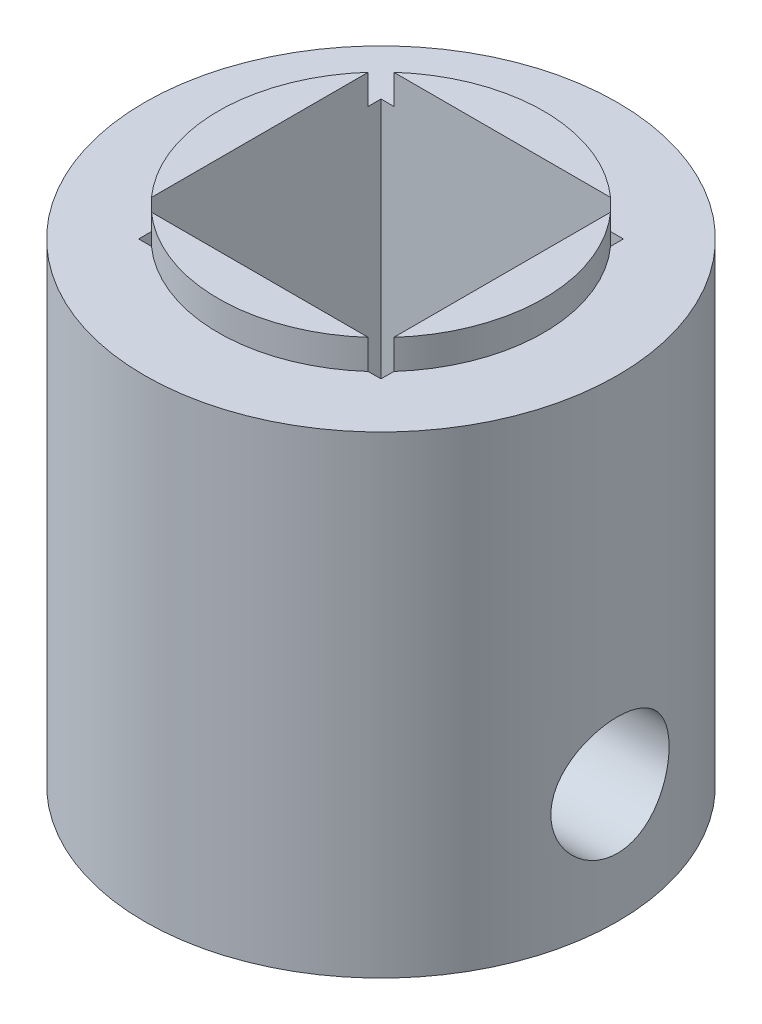
ISO-10303-21;
HEADER;
FILE_DESCRIPTION(('STEP AP214'),'2;1');
FILE_NAME('part.step','',(''),(''),'','','');
FILE_SCHEMA(('AUTOMOTIVE_DESIGN { 1 0 10303 214 1 1 1 1 }'));
ENDSEC;
DATA;
#1=APPLICATION_CONTEXT('core data for automotive mechanical design processes');
#2=APPLICATION_PROTOCOL_DEFINITION('international standard','automotive_design',2000,#1);
#3=PRODUCT_CONTEXT('',#1,'mechanical');
#4=PRODUCT('Part','Part','',(#3));
#5=PRODUCT_RELATED_PRODUCT_CATEGORY('part','',(#4));
#6=PRODUCT_DEFINITION_FORMATION('','',#4);
#7=PRODUCT_DEFINITION_CONTEXT('part definition',#1,'design');
#8=PRODUCT_DEFINITION('design','',#6,#7);
#9=PRODUCT_DEFINITION_SHAPE('','',#8);
#10=(LENGTH_UNIT() NAMED_UNIT(*) SI_UNIT(.MILLI.,.METRE.));
#11=(NAMED_UNIT(*) PLANE_ANGLE_UNIT() SI_UNIT($,.RADIAN.));
#12=(NAMED_UNIT(*) SI_UNIT($,.STERADIAN.) SOLID_ANGLE_UNIT());
#13=UNCERTAINTY_MEASURE_WITH_UNIT(LENGTH_MEASURE(1.E-05),#10,'distance_accuracy_value','');
#14=(GEOMETRIC_REPRESENTATION_CONTEXT(3) GLOBAL_UNCERTAINTY_ASSIGNED_CONTEXT((#13)) GLOBAL_UNIT_ASSIGNED_CONTEXT((#10,
#11,#12)) REPRESENTATION_CONTEXT('',''));
#15=CARTESIAN_POINT('',(0.,0.,0.));
#16=DIRECTION('',(0.,0.,1.));
#17=DIRECTION('',(1.,0.,0.));
#18=AXIS2_PLACEMENT_3D('',#15,#16,#17);
#19=CARTESIAN_POINT('',(0.,1.,0.));
#20=DIRECTION('',(0.,-1.,0.));
#21=DIRECTION('',(0.,0.,-1.));
#22=AXIS2_PLACEMENT_3D('',#19,#20,#21);
#23=CYLINDRICAL_SURFACE('',#22,5.5);
#24=CARTESIAN_POINT('',(0.,1.,0.));
#25=DIRECTION('',(0.,1.,0.));
#26=DIRECTION('',(0.,0.,1.));
#27=AXIS2_PLACEMENT_3D('',#24,#25,#26);
#28=CIRCLE('',#27,5.5);
#29=CARTESIAN_POINT('',(-4.1,1.,-3.66606055596467));
#30=VERTEX_POINT('',#29);
#31=CARTESIAN_POINT('',(-4.1,1.,3.66606055596467));
#32=VERTEX_POINT('',#31);
#33=EDGE_CURVE('E189',#30,#32,#28,.T.);
#34=ORIENTED_EDGE('',*,*,#33,.F.);
#35=DIRECTION('',(0.,-1.,0.));
#36=VECTOR('',#35,1.);
#37=CARTESIAN_POINT('',(-4.1,1.,-3.66606055596467));
#38=LINE('',#37,#36);
#39=CARTESIAN_POINT('',(-4.1,0.,-3.66606055596467));
#40=VERTEX_POINT('',#39);
#41=EDGE_CURVE('E173',#30,#40,#38,.T.);
#42=ORIENTED_EDGE('',*,*,#41,.T.);
#43=CARTESIAN_POINT('',(0.,0.,0.));
#44=DIRECTION('',(0.,1.,0.));
#45=DIRECTION('',(0.,0.,1.));
#46=AXIS2_PLACEMENT_3D('',#43,#44,#45);
#47=CIRCLE('',#46,5.5);
#48=CARTESIAN_POINT('',(-4.1,0.,3.66606055596467));
#49=VERTEX_POINT('',#48);
#50=EDGE_CURVE('E194',#40,#49,#47,.T.);
#51=ORIENTED_EDGE('',*,*,#50,.T.);
#52=DIRECTION('',(0.,-1.,0.));
#53=VECTOR('',#52,1.);
#54=CARTESIAN_POINT('',(-4.1,1.,3.66606055596467));
#55=LINE('',#54,#53);
#56=EDGE_CURVE('E176',#49,#32,#55,.F.);
#57=ORIENTED_EDGE('',*,*,#56,.T.);
#58=EDGE_LOOP('',(#34,#42,#51,#57));
#59=FACE_BOUND('',#58,.T.);
#60=ADVANCED_FACE('F33',(#59),#23,.T.);
#61=CARTESIAN_POINT('',(-3.66606055596467,1.,4.1));
#62=VERTEX_POINT('',#61);
#63=CARTESIAN_POINT('',(3.66606055596467,1.,4.1));
#64=VERTEX_POINT('',#63);
#65=EDGE_CURVE('E186',#62,#64,#28,.T.);
#66=ORIENTED_EDGE('',*,*,#65,.F.);
#67=DIRECTION('',(0.,-1.,0.));
#68=VECTOR('',#67,1.);
#69=CARTESIAN_POINT('',(-3.66606055596467,1.,4.1));
#70=LINE('',#69,#68);
#71=CARTESIAN_POINT('',(-3.66606055596467,0.,4.1));
#72=VERTEX_POINT('',#71);
#73=EDGE_CURVE('E167',#62,#72,#70,.T.);
#74=ORIENTED_EDGE('',*,*,#73,.T.);
#75=CARTESIAN_POINT('',(3.66606055596467,0.,4.1));
#76=VERTEX_POINT('',#75);
#77=EDGE_CURVE('E183',#72,#76,#47,.T.);
#78=ORIENTED_EDGE('',*,*,#77,.T.);
#79=DIRECTION('',(0.,-1.,0.));
#80=VECTOR('',#79,1.);
#81=CARTESIAN_POINT('',(3.66606055596467,1.,4.1));
#82=LINE('',#81,#80);
#83=EDGE_CURVE('E170',#76,#64,#82,.F.);
#84=ORIENTED_EDGE('',*,*,#83,.T.);
#85=EDGE_LOOP('',(#66,#74,#78,#84));
#86=FACE_BOUND('',#85,.T.);
#87=ADVANCED_FACE('F236',(#86),#23,.T.);
#88=CARTESIAN_POINT('',(4.1,1.,3.66606055596467));
#89=VERTEX_POINT('',#88);
#90=CARTESIAN_POINT('',(4.1,1.,-3.66606055596467));
#91=VERTEX_POINT('',#90);
#92=EDGE_CURVE('E191',#89,#91,#28,.T.);
#93=ORIENTED_EDGE('',*,*,#92,.F.);
#94=DIRECTION('',(0.,-1.,0.));
#95=VECTOR('',#94,1.);
#96=CARTESIAN_POINT('',(4.1,1.,3.66606055596467));
#97=LINE('',#96,#95);
#98=CARTESIAN_POINT('',(4.1,0.,3.66606055596467));
#99=VERTEX_POINT('',#98);
#100=EDGE_CURVE('E161',#89,#99,#97,.T.);
#101=ORIENTED_EDGE('',*,*,#100,.T.);
#102=CARTESIAN_POINT('',(4.1,0.,-3.66606055596467));
#103=VERTEX_POINT('',#102);
#104=EDGE_CURVE('E190',#99,#103,#47,.T.);
#105=ORIENTED_EDGE('',*,*,#104,.T.);
#106=DIRECTION('',(0.,-1.,0.));
#107=VECTOR('',#106,1.);
#108=CARTESIAN_POINT('',(4.1,1.,-3.66606055596467));
#109=LINE('',#108,#107);
#110=EDGE_CURVE('E164',#103,#91,#109,.F.);
#111=ORIENTED_EDGE('',*,*,#110,.T.);
#112=EDGE_LOOP('',(#93,#101,#105,#111));
#113=FACE_BOUND('',#112,.T.);
#114=ADVANCED_FACE('F213',(#113),#23,.T.);
#115=CARTESIAN_POINT('',(0.,1.,0.));
#116=DIRECTION('',(0.,1.,0.));
#117=DIRECTION('',(0.,0.,1.));
#118=AXIS2_PLACEMENT_3D('',#115,#116,#117);
#119=PLANE('',#118);
#120=DIRECTION('',(0.,0.,-1.));
#121=VECTOR('',#120,1.);
#122=CARTESIAN_POINT('',(-4.1,1.,-4.1));
#123=LINE('',#122,#121);
#124=EDGE_CURVE('E146',#32,#30,#123,.T.);
#125=ORIENTED_EDGE('',*,*,#124,.T.);
#126=ORIENTED_EDGE('',*,*,#33,.T.);
#127=EDGE_LOOP('',(#125,#126));
#128=FACE_BOUND('',#127,.T.);
#129=ADVANCED_FACE('F225',(#128),#119,.T.);
#130=DIRECTION('',(-1.,0.,0.));
#131=VECTOR('',#130,1.);
#132=CARTESIAN_POINT('',(4.1,1.,4.1));
#133=LINE('',#132,#131);
#134=EDGE_CURVE('E155',#64,#62,#133,.T.);
#135=ORIENTED_EDGE('',*,*,#134,.T.);
#136=ORIENTED_EDGE('',*,*,#65,.T.);
#137=EDGE_LOOP('',(#135,#136));
#138=FACE_BOUND('',#137,.T.);
#139=ADVANCED_FACE('F238',(#138),#119,.T.);
#140=DIRECTION('',(0.,0.,1.));
#141=VECTOR('',#140,1.);
#142=CARTESIAN_POINT('',(4.1,1.,-4.1));
#143=LINE('',#142,#141);
#144=EDGE_CURVE('E239',#91,#89,#143,.T.);
#145=ORIENTED_EDGE('',*,*,#144,.T.);
#146=ORIENTED_EDGE('',*,*,#92,.T.);
#147=EDGE_LOOP('',(#145,#146));
#148=FACE_BOUND('',#147,.T.);
#149=ADVANCED_FACE('F293',(#148),#119,.T.);
#150=CARTESIAN_POINT('',(3.66606055596467,1.,-4.1));
#151=VERTEX_POINT('',#150);
#152=CARTESIAN_POINT('',(-3.66606055596467,1.,-4.1));
#153=VERTEX_POINT('',#152);
#154=EDGE_CURVE('E216',#151,#153,#28,.T.);
#155=ORIENTED_EDGE('',*,*,#154,.F.);
#156=DIRECTION('',(0.,-1.,0.));
#157=VECTOR('',#156,1.);
#158=CARTESIAN_POINT('',(3.66606055596467,1.,-4.1));
#159=LINE('',#158,#157);
#160=CARTESIAN_POINT('',(3.66606055596467,0.,-4.1));
#161=VERTEX_POINT('',#160);
#162=EDGE_CURVE('E152',#151,#161,#159,.T.);
#163=ORIENTED_EDGE('',*,*,#162,.T.);
#164=CARTESIAN_POINT('',(-3.66606055596467,0.,-4.1));
#165=VERTEX_POINT('',#164);
#166=EDGE_CURVE('E415',#161,#165,#47,.T.);
#167=ORIENTED_EDGE('',*,*,#166,.T.);
#168=DIRECTION('',(0.,-1.,0.));
#169=VECTOR('',#168,1.);
#170=CARTESIAN_POINT('',(-3.66606055596467,1.,-4.1));
#171=LINE('',#170,#169);
#172=EDGE_CURVE('E158',#165,#153,#171,.F.);
#173=ORIENTED_EDGE('',*,*,#172,.T.);
#174=EDGE_LOOP('',(#155,#163,#167,#173));
#175=FACE_BOUND('',#174,.T.);
#176=ADVANCED_FACE('F35',(#175),#23,.T.);
#177=DIRECTION('',(1.,0.,0.));
#178=VECTOR('',#177,1.);
#179=CARTESIAN_POINT('',(4.1,1.,-4.1));
#180=LINE('',#179,#178);
#181=EDGE_CURVE('E241',#153,#151,#180,.T.);
#182=ORIENTED_EDGE('',*,*,#181,.T.);
#183=ORIENTED_EDGE('',*,*,#154,.T.);
#184=EDGE_LOOP('',(#182,#183));
#185=FACE_BOUND('',#184,.T.);
#186=ADVANCED_FACE('F292',(#185),#119,.T.);
#187=CARTESIAN_POINT('',(0.,-16.,0.));
#188=DIRECTION('',(0.,1.,0.));
#189=DIRECTION('',(0.,0.,1.));
#190=AXIS2_PLACEMENT_3D('',#187,#188,#189);
#191=CYLINDRICAL_SURFACE('',#190,8.);
#192=CARTESIAN_POINT('',(8.,-10.,0.));
#193=CARTESIAN_POINT('',(7.9999981315735,-10.0000031009842,-0.110501451559641));
#194=CARTESIAN_POINT('',(7.99768770842435,-10.0091887343651,-0.22103754377435));
#195=CARTESIAN_POINT('',(7.98869485106526,-10.045633535076,-0.438941765027376));
#196=CARTESIAN_POINT('',(7.98200993893301,-10.0729029460505,-0.546308062494318));
#197=CARTESIAN_POINT('',(7.96500835109376,-10.1445856712828,-0.754694496243435));
#198=CARTESIAN_POINT('',(7.95469603789411,-10.188978398287,-0.855722084573335));
#199=CARTESIAN_POINT('',(7.93153791743495,-10.2935751867265,-1.04889617587257));
#200=CARTESIAN_POINT('',(7.91869202472209,-10.353779781492,-1.14104237913168));
#201=CARTESIAN_POINT('',(7.89156551455591,-10.4896010528722,-1.31573590306789));
#202=CARTESIAN_POINT('',(7.87726276197502,-10.5654820999454,-1.39807425341474));
#203=CARTESIAN_POINT('',(7.84898160157248,-10.729936273212,-1.54899856960442));
#204=CARTESIAN_POINT('',(7.83500323053157,-10.8185108305959,-1.61758298259892));
#205=CARTESIAN_POINT('',(7.80873034264225,-11.007460302316,-1.74003539039863));
#206=CARTESIAN_POINT('',(7.79646392619748,-11.1079909744116,-1.79366962123352));
#207=CARTESIAN_POINT('',(7.77532659757355,-11.3169978822134,-1.88319587806766));
#208=CARTESIAN_POINT('',(7.76645514259225,-11.4254728444427,-1.91909074058685));
#209=CARTESIAN_POINT('',(7.7533396892843,-11.6449913309355,-1.97140644907302));
#210=CARTESIAN_POINT('',(7.74900654662681,-11.755939861384,-1.98820302444274));
#211=CARTESIAN_POINT('',(7.74519149946122,-11.9791580919991,-2.00301570008854));
#212=CARTESIAN_POINT('',(7.74570880570572,-12.0914275742562,-2.00103485575748));
#213=CARTESIAN_POINT('',(7.75145607355756,-12.3112210769938,-1.9786486995196));
#214=CARTESIAN_POINT('',(7.75657150676391,-12.4187941619538,-1.95869112025418));
#215=CARTESIAN_POINT('',(7.77075612894758,-12.6290147345481,-1.90163224920399));
#216=CARTESIAN_POINT('',(7.77982559958985,-12.7316618707052,-1.86452973609252));
#217=CARTESIAN_POINT('',(7.80100151874212,-12.9303173550028,-1.77385263724958));
#218=CARTESIAN_POINT('',(7.81313769959755,-13.0262482290528,-1.72011555631056));
#219=CARTESIAN_POINT('',(7.83906281127988,-13.2078916130091,-1.59780836801993));
#220=CARTESIAN_POINT('',(7.85285203112837,-13.2936023307563,-1.52923566507845));
#221=CARTESIAN_POINT('',(7.88101174053188,-13.4549381542592,-1.37688456624162));
#222=CARTESIAN_POINT('',(7.89538759304001,-13.5302059867485,-1.29272834422115));
#223=CARTESIAN_POINT('',(7.92274620771675,-13.6656283232852,-1.11281589000493));
#224=CARTESIAN_POINT('',(7.93572892732543,-13.7257823656848,-1.01705930361059));
#225=CARTESIAN_POINT('',(7.9589030945892,-13.8294007816325,-0.816154518241854));
#226=CARTESIAN_POINT('',(7.96908480170303,-13.8728071203392,-0.710975190944829));
#227=CARTESIAN_POINT('',(7.98543889321888,-13.9412230742794,-0.494501344190508));
#228=CARTESIAN_POINT('',(7.99161204452374,-13.9662362085575,-0.383207998867311));
#229=CARTESIAN_POINT('',(7.999139990285,-13.9966100874118,-0.160719960520033));
#230=CARTESIAN_POINT('',(8.00061404677705,-14.0024573681004,-0.0495956266509439));
#231=CARTESIAN_POINT('',(7.99891739752601,-13.9956679972594,0.17204383306868));
#232=CARTESIAN_POINT('',(7.99574710989128,-13.9830330096012,0.282559012859462));
#233=CARTESIAN_POINT('',(7.98519441503143,-13.9400387888115,0.498152358368658));
#234=CARTESIAN_POINT('',(7.97787512247748,-13.9099449820307,0.603286825291675));
#235=CARTESIAN_POINT('',(7.95984942178845,-13.8331905546287,0.807009723270017));
#236=CARTESIAN_POINT('',(7.94914267159856,-13.7865282609158,0.905597492043515));
#237=CARTESIAN_POINT('',(7.92524410568414,-13.6770184948337,1.0953641792398));
#238=CARTESIAN_POINT('',(7.91201156489243,-13.6138985168043,1.18638058911444));
#239=CARTESIAN_POINT('',(7.88459345583226,-13.4736134549374,1.35670215152433));
#240=CARTESIAN_POINT('',(7.87040772335606,-13.3964459471775,1.43600527863068));
#241=CARTESIAN_POINT('',(7.84225275947695,-13.2279973855407,1.58265409076364));
#242=CARTESIAN_POINT('',(7.82829738916375,-13.1364163959968,1.64965849016271));
#243=CARTESIAN_POINT('',(7.80257171169652,-12.9430231540457,1.7673476786836));
#244=CARTESIAN_POINT('',(7.79080130756035,-12.8412113560537,1.81803319221058));
#245=CARTESIAN_POINT('',(7.77090792979553,-12.6307923701159,1.90126856081239));
#246=CARTESIAN_POINT('',(7.76276340389207,-12.5222298288747,1.93392586220542));
#247=CARTESIAN_POINT('',(7.75102325453578,-12.3009204828145,1.98046087993837));
#248=CARTESIAN_POINT('',(7.74742663626581,-12.1881745986233,1.99434270330488));
#249=CARTESIAN_POINT('',(7.74526534938609,-11.9651719681931,2.00271812044533));
#250=CARTESIAN_POINT('',(7.74655910304351,-11.854936753167,1.99775719704016));
#251=CARTESIAN_POINT('',(7.7537054534379,-11.6369281484427,1.96983637108382));
#252=CARTESIAN_POINT('',(7.75955795855809,-11.5291547093151,1.94687683024903));
#253=CARTESIAN_POINT('',(7.77508347576963,-11.3197220545795,1.88390842592373));
#254=CARTESIAN_POINT('',(7.78473353648412,-11.2180302596797,1.84400187290717));
#255=CARTESIAN_POINT('',(7.80677007633105,-11.0227128230484,1.7483532181401));
#256=CARTESIAN_POINT('',(7.81915693494364,-10.9290883024174,1.69260892004559));
#257=CARTESIAN_POINT('',(7.84567512351349,-10.7499271613306,1.56515699818285));
#258=CARTESIAN_POINT('',(7.85984353109009,-10.6646652354347,1.49307088388301));
#259=CARTESIAN_POINT('',(7.88810702995047,-10.5072706069395,1.33571916158632));
#260=CARTESIAN_POINT('',(7.90220210302746,-10.435141026516,1.2504504283482));
#261=CARTESIAN_POINT('',(7.9290354086355,-10.3047849219139,1.06729011560346));
#262=CARTESIAN_POINT('',(7.94174444487824,-10.2468338484379,0.969197896421851));
#263=CARTESIAN_POINT('',(7.96406566633491,-10.1483367160793,0.76435474601397));
#264=CARTESIAN_POINT('',(7.97368006933042,-10.107778185802,0.657610084582321));
#265=CARTESIAN_POINT('',(7.98730746087389,-10.0512375595605,0.459213670991297));
#266=CARTESIAN_POINT('',(7.9920344673692,-10.0320650092621,0.368506894544092));
#267=CARTESIAN_POINT('',(7.99838140309264,-10.0064454085041,0.185208095381712));
#268=CARTESIAN_POINT('',(8.00000156601192,-9.99999740092627,0.0926162149901558));
#269=CARTESIAN_POINT('',(8.,-10.,0.));
#270=B_SPLINE_CURVE_WITH_KNOTS('',3,(#192,#193,#194,#195,#196,#197,#198,#199,#200,#201,#202,
#203,#204,#205,#206,#207,#208,#209,#210,#211,#212,#213,#214,#215,#216,#217,#218,#219,#220,#221,
#222,#223,#224,#225,#226,#227,#228,#229,#230,#231,#232,#233,#234,#235,#236,#237,#238,#239,#240,
#241,#242,#243,#244,#245,#246,#247,#248,#249,#250,#251,#252,#253,#254,#255,#256,#257,#258,#259,
#260,#261,#262,#263,#264,#265,#266,#267,#268,#269),.UNSPECIFIED.,.T.,.F.,(4,2,2,2,2,2,2,2,2,2,2,
2,2,2,2,2,2,2,2,2,2,2,2,2,2,2,2,2,2,2,2,2,2,2,2,2,2,2,4),(0.,0.331164949962519,
0.662517650351866,0.993473203048141,1.32443992022577,1.66152580582852,1.99864972773416,
2.34078196727743,2.68285948225824,3.01808393468093,3.3532538415469,3.68029996013785,
4.00736937959146,4.337740371696,4.66816921119311,5.00802001296453,5.34788119415424,
5.6889097201658,6.02987298255951,6.36211078603463,6.69431868154751,7.02160366023144,
7.34892169767481,7.68204783424897,8.01523150681786,8.35659345610395,8.69794025003772,
9.03723006156476,9.37644564340971,9.70591707202578,10.0353818794581,10.3628853408369,
10.6904342418696,11.0265276855097,11.3627009303165,11.7049624733721,12.0469781843289,
12.3245632392729,12.6021274139515),.UNSPECIFIED.);
#271=CARTESIAN_POINT('',(8.,-10.,0.));
#272=VERTEX_POINT('',#271);
#273=EDGE_CURVE('E244',#272,#272,#270,.T.);
#274=ORIENTED_EDGE('',*,*,#273,.T.);
#275=EDGE_LOOP('',(#274));
#276=FACE_BOUND('',#275,.T.);
#277=CARTESIAN_POINT('',(-7.74596669241483,-12.,2.));
#278=CARTESIAN_POINT('',(-7.74596880070288,-12.1104406007413,1.99999686287446));
#279=CARTESIAN_POINT('',(-7.74835444811678,-12.2209159189428,1.99082099639812));
#280=CARTESIAN_POINT('',(-7.75761489594051,-12.4386940625388,1.95441850037103));
#281=CARTESIAN_POINT('',(-7.76449230897304,-12.5459950035745,1.92718136539368));
#282=CARTESIAN_POINT('',(-7.7819097967692,-12.7542428305497,1.85559295970563));
#283=CARTESIAN_POINT('',(-7.79244514152366,-12.8551977243086,1.81126378228359));
#284=CARTESIAN_POINT('',(-7.81598553623007,-13.0482486820319,1.70681691300911));
#285=CARTESIAN_POINT('',(-7.82899069102791,-13.1403443696642,1.64669855084855));
#286=CARTESIAN_POINT('',(-7.856325730845,-13.3150893162098,1.5109667418495));
#287=CARTESIAN_POINT('',(-7.87067678098427,-13.39751488028,1.43506951016324));
#288=CARTESIAN_POINT('',(-7.89890300412235,-13.5486091154883,1.27054565128053));
#289=CARTESIAN_POINT('',(-7.91277813253111,-13.6172765004974,1.18191783534425));
#290=CARTESIAN_POINT('',(-7.93872332416466,-13.739820374105,0.992916160863164));
#291=CARTESIAN_POINT('',(-7.95076549920474,-13.7934771105292,0.892395660956097));
#292=CARTESIAN_POINT('',(-7.97144649540787,-13.8830477153225,0.683410547434211));
#293=CARTESIAN_POINT('',(-7.98008581867475,-13.9189642015324,0.574947108633554));
#294=CARTESIAN_POINT('',(-7.99283807078544,-13.9713182676629,0.355487007003331));
#295=CARTESIAN_POINT('',(-7.99703915075451,-13.9881357154613,0.244586175639182));
#296=CARTESIAN_POINT('',(-8.00074875285838,-14.0030067034204,0.0214630554102164));
#297=CARTESIAN_POINT('',(-8.00025796877363,-14.0010630177677,-0.0907590356304541));
#298=CARTESIAN_POINT('',(-7.99470475962828,-13.9787401197999,-0.310704494344774));
#299=CARTESIAN_POINT('',(-7.98974401872699,-13.9587709399569,-0.418472431202133));
#300=CARTESIAN_POINT('',(-7.97592669219883,-13.9016229839612,-0.629076494827372));
#301=CARTESIAN_POINT('',(-7.96706989918753,-13.8644432916981,-0.731912358740875));
#302=CARTESIAN_POINT('',(-7.94630007760717,-13.7735979434503,-0.930813407003612));
#303=CARTESIAN_POINT('',(-7.93436015756043,-13.7197863642706,-1.02680901953301));
#304=CARTESIAN_POINT('',(-7.90871923047719,-13.597315456707,-1.20855124468098));
#305=CARTESIAN_POINT('',(-7.89501791721992,-13.5286535451515,-1.29429607017101));
#306=CARTESIAN_POINT('',(-7.86690971015616,-13.3762330064141,-1.45554807016991));
#307=CARTESIAN_POINT('',(-7.85249375620734,-13.2921160861218,-1.5307153581504));
#308=CARTESIAN_POINT('',(-7.82492034813365,-13.1123200211678,-1.66595275192604));
#309=CARTESIAN_POINT('',(-7.81176295284776,-13.0166403364072,-1.72602215209203));
#310=CARTESIAN_POINT('',(-7.78816397465319,-12.8157679726808,-1.82957625804519));
#311=CARTESIAN_POINT('',(-7.77773586980577,-12.7105314157494,-1.87297913394098));
#312=CARTESIAN_POINT('',(-7.76094912111966,-12.4939316255388,-1.94137124127268));
#313=CARTESIAN_POINT('',(-7.75458960648175,-12.3825697088135,-1.96636441310582));
#314=CARTESIAN_POINT('',(-7.74684284831313,-12.1600323987815,-1.99666371093214));
#315=CARTESIAN_POINT('',(-7.74532871274919,-12.0489297653363,-2.0024723791357));
#316=CARTESIAN_POINT('',(-7.74709874784831,-11.8273424507375,-1.99561359241244));
#317=CARTESIAN_POINT('',(-7.75038247681013,-11.716857713639,-1.98294783827904));
#318=CARTESIAN_POINT('',(-7.76125665563648,-11.5015085880362,-1.93994037115013));
#319=CARTESIAN_POINT('',(-7.768775761875,-11.3965818187433,-1.9098912546254));
#320=CARTESIAN_POINT('',(-7.7872057461677,-11.1932548337187,-1.8332944653365));
#321=CARTESIAN_POINT('',(-7.79811702598891,-11.0948553927557,-1.78674483817004));
#322=CARTESIAN_POINT('',(-7.8223690967461,-10.9052469777061,-1.67741653434925));
#323=CARTESIAN_POINT('',(-7.83575334885313,-10.8142169279655,-1.6143374030685));
#324=CARTESIAN_POINT('',(-7.86333666457373,-10.6438493097589,-1.47412058586891));
#325=CARTESIAN_POINT('',(-7.87753586182776,-10.5645136666799,-1.39698058961088));
#326=CARTESIAN_POINT('',(-7.90557922425285,-10.4177511659432,-1.22852544196945));
#327=CARTESIAN_POINT('',(-7.91940561649468,-10.3506719499609,-1.13690390506319));
#328=CARTESIAN_POINT('',(-7.94477773290987,-10.232851306439,-0.94340536538935));
#329=CARTESIAN_POINT('',(-7.95632357603169,-10.1821090267134,-0.841528897915181));
#330=CARTESIAN_POINT('',(-7.9757609259065,-10.0988431723777,-0.631116403462181));
#331=CARTESIAN_POINT('',(-7.98367864017925,-10.0661885724967,-0.522634762055765));
#332=CARTESIAN_POINT('',(-7.99508234716634,-10.0196317323133,-0.301499520637615));
#333=CARTESIAN_POINT('',(-7.99856919514738,-10.0057258730088,-0.188846730082482));
#334=CARTESIAN_POINT('',(-8.00068338817612,-9.99726482084892,0.0341670528866459));
#335=CARTESIAN_POINT('',(-7.99943957759977,-10.0021965818092,0.144507653932043));
#336=CARTESIAN_POINT('',(-7.99251792914887,-10.0300956545887,0.362734992829501));
#337=CARTESIAN_POINT('',(-7.98684022314338,-10.0530624300263,0.470621803561857));
#338=CARTESIAN_POINT('',(-7.97170865707778,-10.1161044395417,0.680342071289547));
#339=CARTESIAN_POINT('',(-7.96227529004785,-10.1560869066288,0.782204989161724));
#340=CARTESIAN_POINT('',(-7.94062577827316,-10.2519411580391,0.977834106083247));
#341=CARTESIAN_POINT('',(-7.92840928277515,-10.307814945341,1.07159928253127));
#342=CARTESIAN_POINT('',(-7.90214499360574,-10.4354304679923,1.25080385684661));
#343=CARTESIAN_POINT('',(-7.88806033883329,-10.5075202858077,1.33598997659667));
#344=CARTESIAN_POINT('',(-7.85981298114379,-10.6648457039547,1.49323004054701));
#345=CARTESIAN_POINT('',(-7.84565025934604,-10.7500846322223,1.56528065015318));
#346=CARTESIAN_POINT('',(-7.81854951691005,-10.9332028283789,1.69552405294366));
#347=CARTESIAN_POINT('',(-7.80563927346578,-11.0312882467305,1.75343323883276));
#348=CARTESIAN_POINT('',(-7.78287910989656,-11.2361109797496,1.85185379317094));
#349=CARTESIAN_POINT('',(-7.77302696466428,-11.3428419321877,1.8923778195043));
#350=CARTESIAN_POINT('',(-7.75903817501475,-11.5411540236703,1.94884505714201));
#351=CARTESIAN_POINT('',(-7.75417326006998,-11.6317863287723,1.96798634119376));
#352=CARTESIAN_POINT('',(-7.7476367716524,-11.8149377379954,1.99356458514354));
#353=CARTESIAN_POINT('',(-7.74596492578215,-11.9074566804888,2.0000026287435));
#354=CARTESIAN_POINT('',(-7.74596669241483,-12.,2.));
#355=B_SPLINE_CURVE_WITH_KNOTS('',3,(#277,#278,#279,#280,#281,#282,#283,#284,#285,#286,#287,
#288,#289,#290,#291,#292,#293,#294,#295,#296,#297,#298,#299,#300,#301,#302,#303,#304,#305,#306,
#307,#308,#309,#310,#311,#312,#313,#314,#315,#316,#317,#318,#319,#320,#321,#322,#323,#324,#325,
#326,#327,#328,#329,#330,#331,#332,#333,#334,#335,#336,#337,#338,#339,#340,#341,#342,#343,#344,
#345,#346,#347,#348,#349,#350,#351,#352,#353,#354),.UNSPECIFIED.,.T.,.F.,(4,2,2,2,2,2,2,2,2,2,2,
2,2,2,2,2,2,2,2,2,2,2,2,2,2,2,2,2,2,2,2,2,2,2,2,2,2,2,4),(0.,0.33098195338891,0.662156593142933,
0.992904581732817,1.32366661404383,1.66099163354381,1.99834817183893,2.34041197118336,
2.68242527877674,3.01751000796277,3.35254518932816,3.68014610151158,4.00776445379829,
4.33834299403555,4.66897908375131,5.00856373257529,5.34816424959842,5.68941145606722,
6.03058560103638,6.36274859809373,6.69488101747041,7.02157924007365,7.34831617137134,
7.68146276687326,8.01466415108036,8.35620264772255,8.69772332575643,9.03673658245543,
9.3756843912723,9.70546756901965,10.0352409390158,10.3632390124777,10.6912784459046,
11.0271767726566,11.3631602525241,11.7054118182895,12.0474137709606,12.3247826174462,
12.6021278008238),.UNSPECIFIED.);
#356=CARTESIAN_POINT('',(-7.74596669241483,-12.,2.));
#357=VERTEX_POINT('',#356);
#358=EDGE_CURVE('E246',#357,#357,#355,.T.);
#359=ORIENTED_EDGE('',*,*,#358,.T.);
#360=EDGE_LOOP('',(#359));
#361=FACE_BOUND('',#360,.T.);
#362=CARTESIAN_POINT('',(0.,-16.,0.));
#363=DIRECTION('',(0.,-1.,0.));
#364=DIRECTION('',(0.,0.,-1.));
#365=AXIS2_PLACEMENT_3D('',#362,#363,#364);
#366=CIRCLE('',#365,8.);
#367=CARTESIAN_POINT('',(0.,-16.,-8.));
#368=VERTEX_POINT('',#367);
#369=EDGE_CURVE('E180',#368,#368,#366,.T.);
#370=ORIENTED_EDGE('',*,*,#369,.F.);
#371=EDGE_LOOP('',(#370));
#372=FACE_BOUND('',#371,.T.);
#373=CARTESIAN_POINT('',(0.,0.,0.));
#374=DIRECTION('',(0.,-1.,0.));
#375=DIRECTION('',(0.,0.,-1.));
#376=AXIS2_PLACEMENT_3D('',#373,#374,#375);
#377=CIRCLE('',#376,8.);
#378=CARTESIAN_POINT('',(0.,0.,-8.));
#379=VERTEX_POINT('',#378);
#380=EDGE_CURVE('E179',#379,#379,#377,.T.);
#381=ORIENTED_EDGE('',*,*,#380,.T.);
#382=EDGE_LOOP('',(#381));
#383=FACE_BOUND('',#382,.T.);
#384=ADVANCED_FACE('F263',(#276,#361,#372,#383),#191,.T.);
#385=CARTESIAN_POINT('',(0.,-16.,0.));
#386=DIRECTION('',(0.,-1.,0.));
#387=DIRECTION('',(0.,0.,-1.));
#388=AXIS2_PLACEMENT_3D('',#385,#386,#387);
#389=PLANE('',#388);
#390=DIRECTION('',(0.,0.,-1.));
#391=VECTOR('',#390,1.);
#392=CARTESIAN_POINT('',(-4.1,-16.,-4.1));
#393=LINE('',#392,#391);
#394=CARTESIAN_POINT('',(-4.1,-16.,4.1));
#395=VERTEX_POINT('',#394);
#396=CARTESIAN_POINT('',(-4.1,-16.,-4.1));
#397=VERTEX_POINT('',#396);
#398=EDGE_CURVE('E51',#395,#397,#393,.T.);
#399=ORIENTED_EDGE('',*,*,#398,.F.);
#400=DIRECTION('',(-1.,0.,0.));
#401=VECTOR('',#400,1.);
#402=CARTESIAN_POINT('',(4.1,-16.,4.1));
#403=LINE('',#402,#401);
#404=CARTESIAN_POINT('',(4.1,-16.,4.1));
#405=VERTEX_POINT('',#404);
#406=EDGE_CURVE('E144',#405,#395,#403,.T.);
#407=ORIENTED_EDGE('',*,*,#406,.F.);
#408=DIRECTION('',(0.,0.,1.));
#409=VECTOR('',#408,1.);
#410=CARTESIAN_POINT('',(4.1,-16.,-4.1));
#411=LINE('',#410,#409);
#412=CARTESIAN_POINT('',(4.1,-16.,-4.1));
#413=VERTEX_POINT('',#412);
#414=EDGE_CURVE('E128',#413,#405,#411,.T.);
#415=ORIENTED_EDGE('',*,*,#414,.F.);
#416=DIRECTION('',(1.,0.,0.));
#417=VECTOR('',#416,1.);
#418=CARTESIAN_POINT('',(4.1,-16.,-4.1));
#419=LINE('',#418,#417);
#420=EDGE_CURVE('E137',#397,#413,#419,.T.);
#421=ORIENTED_EDGE('',*,*,#420,.F.);
#422=EDGE_LOOP('',(#399,#407,#415,#421));
#423=FACE_BOUND('',#422,.T.);
#424=ORIENTED_EDGE('',*,*,#369,.T.);
#425=EDGE_LOOP('',(#424));
#426=FACE_BOUND('',#425,.T.);
#427=ADVANCED_FACE('F141',(#423,#426),#389,.T.);
#428=CARTESIAN_POINT('',(0.,0.,0.));
#429=DIRECTION('',(0.,-1.,0.));
#430=DIRECTION('',(0.,0.,-1.));
#431=AXIS2_PLACEMENT_3D('',#428,#429,#430);
#432=PLANE('',#431);
#433=DIRECTION('',(-1.,0.,0.));
#434=VECTOR('',#433,1.);
#435=CARTESIAN_POINT('',(0.,0.,4.1));
#436=LINE('',#435,#434);
#437=CARTESIAN_POINT('',(-4.1,0.,4.1));
#438=VERTEX_POINT('',#437);
#439=EDGE_CURVE('E42',#72,#438,#436,.T.);
#440=ORIENTED_EDGE('',*,*,#439,.T.);
#441=DIRECTION('',(0.,0.,-1.));
#442=VECTOR('',#441,1.);
#443=CARTESIAN_POINT('',(-4.1,0.,0.));
#444=LINE('',#443,#442);
#445=EDGE_CURVE('E11',#438,#49,#444,.T.);
#446=ORIENTED_EDGE('',*,*,#445,.T.);
#447=ORIENTED_EDGE('',*,*,#50,.F.);
#448=CARTESIAN_POINT('',(-4.1,0.,-4.1));
#449=VERTEX_POINT('',#448);
#450=EDGE_CURVE('E44',#40,#449,#444,.T.);
#451=ORIENTED_EDGE('',*,*,#450,.T.);
#452=DIRECTION('',(1.,0.,0.));
#453=VECTOR('',#452,1.);
#454=CARTESIAN_POINT('',(0.,0.,-4.1));
#455=LINE('',#454,#453);
#456=EDGE_CURVE('E197',#449,#165,#455,.T.);
#457=ORIENTED_EDGE('',*,*,#456,.T.);
#458=ORIENTED_EDGE('',*,*,#166,.F.);
#459=CARTESIAN_POINT('',(4.1,0.,-4.1));
#460=VERTEX_POINT('',#459);
#461=EDGE_CURVE('E195',#161,#460,#455,.T.);
#462=ORIENTED_EDGE('',*,*,#461,.T.);
#463=DIRECTION('',(0.,0.,1.));
#464=VECTOR('',#463,1.);
#465=CARTESIAN_POINT('',(4.1,0.,0.));
#466=LINE('',#465,#464);
#467=EDGE_CURVE('E131',#460,#103,#466,.T.);
#468=ORIENTED_EDGE('',*,*,#467,.T.);
#469=ORIENTED_EDGE('',*,*,#104,.F.);
#470=CARTESIAN_POINT('',(4.1,0.,4.1));
#471=VERTEX_POINT('',#470);
#472=EDGE_CURVE('E198',#99,#471,#466,.T.);
#473=ORIENTED_EDGE('',*,*,#472,.T.);
#474=EDGE_CURVE('E200',#471,#76,#436,.T.);
#475=ORIENTED_EDGE('',*,*,#474,.T.);
#476=ORIENTED_EDGE('',*,*,#77,.F.);
#477=EDGE_LOOP('',(#440,#446,#447,#451,#457,#458,#462,#468,#469,#473,#475,#476));
#478=FACE_BOUND('',#477,.T.);
#479=ORIENTED_EDGE('',*,*,#380,.F.);
#480=EDGE_LOOP('',(#479));
#481=FACE_BOUND('',#480,.T.);
#482=ADVANCED_FACE('F207',(#478,#481),#432,.F.);
#483=CARTESIAN_POINT('',(-4.1,1.,-4.1));
#484=DIRECTION('',(-1.,0.,0.));
#485=DIRECTION('',(0.,0.,1.));
#486=AXIS2_PLACEMENT_3D('',#483,#484,#485);
#487=PLANE('',#486);
#488=CARTESIAN_POINT('',(-4.1,-12.,0.));
#489=DIRECTION('',(-1.,0.,0.));
#490=DIRECTION('',(0.,0.,1.));
#491=AXIS2_PLACEMENT_3D('',#488,#489,#490);
#492=CIRCLE('',#491,2.);
#493=CARTESIAN_POINT('',(-4.1,-12.,2.));
#494=VERTEX_POINT('',#493);
#495=EDGE_CURVE('E251',#494,#494,#492,.T.);
#496=ORIENTED_EDGE('',*,*,#495,.T.);
#497=EDGE_LOOP('',(#496));
#498=FACE_BOUND('',#497,.T.);
#499=ORIENTED_EDGE('',*,*,#445,.F.);
#500=DIRECTION('',(0.,-1.,0.));
#501=VECTOR('',#500,1.);
#502=CARTESIAN_POINT('',(-4.1,1.,4.1));
#503=LINE('',#502,#501);
#504=EDGE_CURVE('E150',#438,#395,#503,.T.);
#505=ORIENTED_EDGE('',*,*,#504,.T.);
#506=ORIENTED_EDGE('',*,*,#398,.T.);
#507=DIRECTION('',(0.,-1.,0.));
#508=VECTOR('',#507,1.);
#509=CARTESIAN_POINT('',(-4.1,1.,-4.1));
#510=LINE('',#509,#508);
#511=EDGE_CURVE('E134',#449,#397,#510,.T.);
#512=ORIENTED_EDGE('',*,*,#511,.F.);
#513=ORIENTED_EDGE('',*,*,#450,.F.);
#514=ORIENTED_EDGE('',*,*,#41,.F.);
#515=ORIENTED_EDGE('',*,*,#124,.F.);
#516=ORIENTED_EDGE('',*,*,#56,.F.);
#517=EDGE_LOOP('',(#499,#505,#506,#512,#513,#514,#515,#516));
#518=FACE_BOUND('',#517,.T.);
#519=ADVANCED_FACE('F229',(#498,#518),#487,.F.);
#520=CARTESIAN_POINT('',(4.1,1.,4.1));
#521=DIRECTION('',(0.,0.,1.));
#522=DIRECTION('',(1.,0.,0.));
#523=AXIS2_PLACEMENT_3D('',#520,#521,#522);
#524=PLANE('',#523);
#525=ORIENTED_EDGE('',*,*,#474,.F.);
#526=DIRECTION('',(0.,-1.,0.));
#527=VECTOR('',#526,1.);
#528=CARTESIAN_POINT('',(4.1,1.,4.1));
#529=LINE('',#528,#527);
#530=EDGE_CURVE('E133',#471,#405,#529,.T.);
#531=ORIENTED_EDGE('',*,*,#530,.T.);
#532=ORIENTED_EDGE('',*,*,#406,.T.);
#533=ORIENTED_EDGE('',*,*,#504,.F.);
#534=ORIENTED_EDGE('',*,*,#439,.F.);
#535=ORIENTED_EDGE('',*,*,#73,.F.);
#536=ORIENTED_EDGE('',*,*,#134,.F.);
#537=ORIENTED_EDGE('',*,*,#83,.F.);
#538=EDGE_LOOP('',(#525,#531,#532,#533,#534,#535,#536,#537));
#539=FACE_BOUND('',#538,.T.);
#540=ADVANCED_FACE('F232',(#539),#524,.F.);
#541=CARTESIAN_POINT('',(4.1,1.,-4.1));
#542=DIRECTION('',(1.,0.,0.));
#543=DIRECTION('',(0.,0.,-1.));
#544=AXIS2_PLACEMENT_3D('',#541,#542,#543);
#545=PLANE('',#544);
#546=CARTESIAN_POINT('',(4.1,-12.,0.));
#547=DIRECTION('',(1.,0.,0.));
#548=DIRECTION('',(0.,0.,-1.));
#549=AXIS2_PLACEMENT_3D('',#546,#547,#548);
#550=CIRCLE('',#549,2.);
#551=CARTESIAN_POINT('',(4.1,-12.,-2.));
#552=VERTEX_POINT('',#551);
#553=EDGE_CURVE('E37',#552,#552,#550,.T.);
#554=ORIENTED_EDGE('',*,*,#553,.T.);
#555=EDGE_LOOP('',(#554));
#556=FACE_BOUND('',#555,.T.);
#557=ORIENTED_EDGE('',*,*,#467,.F.);
#558=DIRECTION('',(0.,-1.,0.));
#559=VECTOR('',#558,1.);
#560=CARTESIAN_POINT('',(4.1,1.,-4.1));
#561=LINE('',#560,#559);
#562=EDGE_CURVE('E59',#460,#413,#561,.T.);
#563=ORIENTED_EDGE('',*,*,#562,.T.);
#564=ORIENTED_EDGE('',*,*,#414,.T.);
#565=ORIENTED_EDGE('',*,*,#530,.F.);
#566=ORIENTED_EDGE('',*,*,#472,.F.);
#567=ORIENTED_EDGE('',*,*,#100,.F.);
#568=ORIENTED_EDGE('',*,*,#144,.F.);
#569=ORIENTED_EDGE('',*,*,#110,.F.);
#570=EDGE_LOOP('',(#557,#563,#564,#565,#566,#567,#568,#569));
#571=FACE_BOUND('',#570,.T.);
#572=ADVANCED_FACE('F125',(#556,#571),#545,.F.);
#573=CARTESIAN_POINT('',(4.1,1.,-4.1));
#574=DIRECTION('',(0.,0.,-1.));
#575=DIRECTION('',(-1.,0.,0.));
#576=AXIS2_PLACEMENT_3D('',#573,#574,#575);
#577=PLANE('',#576);
#578=ORIENTED_EDGE('',*,*,#456,.F.);
#579=ORIENTED_EDGE('',*,*,#511,.T.);
#580=ORIENTED_EDGE('',*,*,#420,.T.);
#581=ORIENTED_EDGE('',*,*,#562,.F.);
#582=ORIENTED_EDGE('',*,*,#461,.F.);
#583=ORIENTED_EDGE('',*,*,#162,.F.);
#584=ORIENTED_EDGE('',*,*,#181,.F.);
#585=ORIENTED_EDGE('',*,*,#172,.F.);
#586=EDGE_LOOP('',(#578,#579,#580,#581,#582,#583,#584,#585));
#587=FACE_BOUND('',#586,.T.);
#588=ADVANCED_FACE('F138',(#587),#577,.F.);
#589=CARTESIAN_POINT('',(8.,-12.,0.));
#590=DIRECTION('',(-1.,0.,0.));
#591=DIRECTION('',(0.,0.,1.));
#592=AXIS2_PLACEMENT_3D('',#589,#590,#591);
#593=CYLINDRICAL_SURFACE('',#592,2.);
#594=ORIENTED_EDGE('',*,*,#553,.F.);
#595=EDGE_LOOP('',(#594));
#596=FACE_BOUND('',#595,.T.);
#597=ORIENTED_EDGE('',*,*,#273,.F.);
#598=EDGE_LOOP('',(#597));
#599=FACE_BOUND('',#598,.T.);
#600=ADVANCED_FACE('F266',(#596,#599),#593,.F.);
#601=ORIENTED_EDGE('',*,*,#495,.F.);
#602=EDGE_LOOP('',(#601));
#603=FACE_BOUND('',#602,.T.);
#604=ORIENTED_EDGE('',*,*,#358,.F.);
#605=EDGE_LOOP('',(#604));
#606=FACE_BOUND('',#605,.T.);
#607=ADVANCED_FACE('F270',(#603,#606),#593,.F.);
#608=CLOSED_SHELL('',(#60,#87,#114,#129,#139,#149,#176,#186,#384,#427,#482,#519,#540,#572,#588,
#600,#607));
#609=MANIFOLD_SOLID_BREP('B2',#608);
#610=ADVANCED_BREP_SHAPE_REPRESENTATION('',(#18,#609),#14);
#611=SHAPE_DEFINITION_REPRESENTATION(#9,#610);
ENDSEC;
END-ISO-10303-21;
